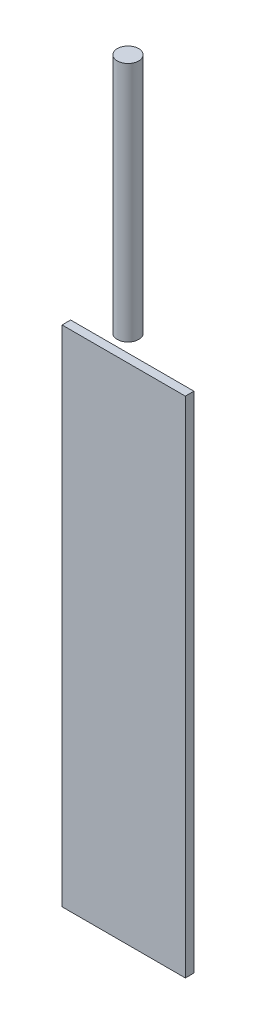
ISO-10303-21;
HEADER;
FILE_DESCRIPTION(('STEP AP214'),'2;1');
FILE_NAME('part.step','',(''),(''),'','','');
FILE_SCHEMA(('AUTOMOTIVE_DESIGN { 1 0 10303 214 1 1 1 1 }'));
ENDSEC;
DATA;
#1=APPLICATION_CONTEXT('core data for automotive mechanical design processes');
#2=APPLICATION_PROTOCOL_DEFINITION('international standard','automotive_design',2000,#1);
#3=PRODUCT_CONTEXT('',#1,'mechanical');
#4=PRODUCT('Part','Part','',(#3));
#5=PRODUCT_RELATED_PRODUCT_CATEGORY('part','',(#4));
#6=PRODUCT_DEFINITION_FORMATION('','',#4);
#7=PRODUCT_DEFINITION_CONTEXT('part definition',#1,'design');
#8=PRODUCT_DEFINITION('design','',#6,#7);
#9=PRODUCT_DEFINITION_SHAPE('','',#8);
#10=(LENGTH_UNIT() NAMED_UNIT(*) SI_UNIT(.MILLI.,.METRE.));
#11=(NAMED_UNIT(*) PLANE_ANGLE_UNIT() SI_UNIT($,.RADIAN.));
#12=(NAMED_UNIT(*) SI_UNIT($,.STERADIAN.) SOLID_ANGLE_UNIT());
#13=UNCERTAINTY_MEASURE_WITH_UNIT(LENGTH_MEASURE(1.E-05),#10,'distance_accuracy_value','');
#14=(GEOMETRIC_REPRESENTATION_CONTEXT(3) GLOBAL_UNCERTAINTY_ASSIGNED_CONTEXT((#13)) GLOBAL_UNIT_ASSIGNED_CONTEXT((#10,
#11,#12)) REPRESENTATION_CONTEXT('',''));
#15=CARTESIAN_POINT('',(0.,0.,0.));
#16=DIRECTION('',(0.,0.,1.));
#17=DIRECTION('',(1.,0.,0.));
#18=AXIS2_PLACEMENT_3D('',#15,#16,#17);
#19=CARTESIAN_POINT('',(20.,-132.5,26.));
#20=DIRECTION('',(0.,-1.,0.));
#21=DIRECTION('',(0.,0.,-1.));
#22=AXIS2_PLACEMENT_3D('',#19,#20,#21);
#23=CYLINDRICAL_SURFACE('',#22,2.);
#24=CARTESIAN_POINT('',(20.,-132.5,26.));
#25=DIRECTION('',(0.,1.,0.));
#26=DIRECTION('',(0.,0.,1.));
#27=AXIS2_PLACEMENT_3D('',#24,#25,#26);
#28=CIRCLE('',#27,2.);
#29=CARTESIAN_POINT('',(20.,-132.5,24.));
#30=VERTEX_POINT('',#29);
#31=EDGE_CURVE('E11',#30,#30,#28,.T.);
#32=CARTESIAN_POINT('',(20.,-177.5,26.));
#33=DIRECTION('',(0.,1.,0.));
#34=DIRECTION('',(0.,0.,1.));
#35=AXIS2_PLACEMENT_3D('',#32,#33,#34);
#36=CIRCLE('',#35,2.);
#37=CARTESIAN_POINT('',(20.,-177.5,24.));
#38=VERTEX_POINT('',#37);
#39=EDGE_CURVE('E50',#38,#38,#36,.T.);
#40=CARTESIAN_POINT('',(20.,-132.5,24.));
#41=CARTESIAN_POINT('',(20.,-132.96875,24.));
#42=CARTESIAN_POINT('',(20.,-133.4375,24.));
#43=CARTESIAN_POINT('',(20.,-134.375,24.));
#44=CARTESIAN_POINT('',(20.,-134.84375,24.));
#45=CARTESIAN_POINT('',(20.,-135.78125,24.));
#46=CARTESIAN_POINT('',(20.,-136.25,24.));
#47=CARTESIAN_POINT('',(20.,-137.1875,24.));
#48=CARTESIAN_POINT('',(20.,-137.65625,24.));
#49=CARTESIAN_POINT('',(20.,-138.59375,24.));
#50=CARTESIAN_POINT('',(20.,-139.0625,24.));
#51=CARTESIAN_POINT('',(20.,-140.,24.));
#52=CARTESIAN_POINT('',(20.,-140.46875,24.));
#53=CARTESIAN_POINT('',(20.,-141.40625,24.));
#54=CARTESIAN_POINT('',(20.,-141.875,24.));
#55=CARTESIAN_POINT('',(20.,-142.8125,24.));
#56=CARTESIAN_POINT('',(20.,-143.28125,24.));
#57=CARTESIAN_POINT('',(20.,-144.21875,24.));
#58=CARTESIAN_POINT('',(20.,-144.6875,24.));
#59=CARTESIAN_POINT('',(20.,-145.625,24.));
#60=CARTESIAN_POINT('',(20.,-146.09375,24.));
#61=CARTESIAN_POINT('',(20.,-147.03125,24.));
#62=CARTESIAN_POINT('',(20.,-147.5,24.));
#63=CARTESIAN_POINT('',(20.,-148.4375,24.));
#64=CARTESIAN_POINT('',(20.,-148.90625,24.));
#65=CARTESIAN_POINT('',(20.,-149.84375,24.));
#66=CARTESIAN_POINT('',(20.,-150.3125,24.));
#67=CARTESIAN_POINT('',(20.,-151.25,24.));
#68=CARTESIAN_POINT('',(20.,-151.71875,24.));
#69=CARTESIAN_POINT('',(20.,-152.65625,24.));
#70=CARTESIAN_POINT('',(20.,-153.125,24.));
#71=CARTESIAN_POINT('',(20.,-154.0625,24.));
#72=CARTESIAN_POINT('',(20.,-154.53125,24.));
#73=CARTESIAN_POINT('',(20.,-155.46875,24.));
#74=CARTESIAN_POINT('',(20.,-155.9375,24.));
#75=CARTESIAN_POINT('',(20.,-156.875,24.));
#76=CARTESIAN_POINT('',(20.,-157.34375,24.));
#77=CARTESIAN_POINT('',(20.,-158.28125,24.));
#78=CARTESIAN_POINT('',(20.,-158.75,24.));
#79=CARTESIAN_POINT('',(20.,-159.6875,24.));
#80=CARTESIAN_POINT('',(20.,-160.15625,24.));
#81=CARTESIAN_POINT('',(20.,-161.09375,24.));
#82=CARTESIAN_POINT('',(20.,-161.5625,24.));
#83=CARTESIAN_POINT('',(20.,-162.5,24.));
#84=CARTESIAN_POINT('',(20.,-162.96875,24.));
#85=CARTESIAN_POINT('',(20.,-163.90625,24.));
#86=CARTESIAN_POINT('',(20.,-164.375,24.));
#87=CARTESIAN_POINT('',(20.,-165.3125,24.));
#88=CARTESIAN_POINT('',(20.,-165.78125,24.));
#89=CARTESIAN_POINT('',(20.,-166.71875,24.));
#90=CARTESIAN_POINT('',(20.,-167.1875,24.));
#91=CARTESIAN_POINT('',(20.,-168.125,24.));
#92=CARTESIAN_POINT('',(20.,-168.59375,24.));
#93=CARTESIAN_POINT('',(20.,-169.53125,24.));
#94=CARTESIAN_POINT('',(20.,-170.,24.));
#95=CARTESIAN_POINT('',(20.,-170.9375,24.));
#96=CARTESIAN_POINT('',(20.,-171.40625,24.));
#97=CARTESIAN_POINT('',(20.,-172.34375,24.));
#98=CARTESIAN_POINT('',(20.,-172.8125,24.));
#99=CARTESIAN_POINT('',(20.,-173.75,24.));
#100=CARTESIAN_POINT('',(20.,-174.21875,24.));
#101=CARTESIAN_POINT('',(20.,-175.15625,24.));
#102=CARTESIAN_POINT('',(20.,-175.625,24.));
#103=CARTESIAN_POINT('',(20.,-176.5625,24.));
#104=CARTESIAN_POINT('',(20.,-177.03125,24.));
#105=CARTESIAN_POINT('',(20.,-177.5,24.));
#106=B_SPLINE_CURVE_WITH_KNOTS('',3,(#40,#41,#42,#43,#44,#45,#46,#47,#48,#49,#50,#51,#52,#53,
#54,#55,#56,#57,#58,#59,#60,#61,#62,#63,#64,#65,#66,#67,#68,#69,#70,#71,#72,#73,#74,#75,#76,#77,
#78,#79,#80,#81,#82,#83,#84,#85,#86,#87,#88,#89,#90,#91,#92,#93,#94,#95,#96,#97,#98,#99,#100,
#101,#102,#103,#104,#105),.UNSPECIFIED.,.F.,.F.,(4,2,2,2,2,2,2,2,2,2,2,2,2,2,2,2,2,2,2,2,2,2,2,
2,2,2,2,2,2,2,2,2,4),(0.,1.40625000000003,2.81250000000002,4.21875000000002,5.62500000000002,
7.03125000000002,8.43750000000001,9.84375000000001,11.25,12.65625,14.0625,15.46875,16.875,
18.28125,19.6875,21.09375,22.5,23.90625,25.3125,26.71875,28.125,29.53125,30.9375,32.34375,33.75,
35.15625,36.5625,37.96875,39.375,40.78125,42.1875,43.59375,45.),.UNSPECIFIED.);
#107=EDGE_CURVE('BSEAM47',#30,#38,#106,.T.);
#108=ORIENTED_EDGE('',*,*,#31,.F.);
#109=ORIENTED_EDGE('',*,*,#39,.T.);
#110=ORIENTED_EDGE('',*,*,#107,.T.);
#111=ORIENTED_EDGE('',*,*,#107,.F.);
#112=EDGE_LOOP('',(#108,#110,#109,#111));
#113=FACE_BOUND('',#112,.T.);
#114=ADVANCED_FACE('F47',(#113),#23,.T.);
#115=CARTESIAN_POINT('',(20.,-132.5,26.));
#116=DIRECTION('',(0.,1.,0.));
#117=DIRECTION('',(0.,0.,1.));
#118=AXIS2_PLACEMENT_3D('',#115,#116,#117);
#119=PLANE('',#118);
#120=ORIENTED_EDGE('',*,*,#31,.T.);
#121=EDGE_LOOP('',(#120));
#122=FACE_BOUND('',#121,.T.);
#123=ADVANCED_FACE('F62',(#122),#119,.T.);
#124=CARTESIAN_POINT('',(20.,-177.5,26.));
#125=DIRECTION('',(0.,1.,0.));
#126=DIRECTION('',(0.,0.,1.));
#127=AXIS2_PLACEMENT_3D('',#124,#125,#126);
#128=PLANE('',#127);
#129=ORIENTED_EDGE('',*,*,#39,.F.);
#130=EDGE_LOOP('',(#129));
#131=FACE_BOUND('',#130,.T.);
#132=ADVANCED_FACE('F60',(#131),#128,.F.);
#133=CLOSED_SHELL('',(#114,#123,#132));
#134=MANIFOLD_SOLID_BREP('B2',#133);
#135=CARTESIAN_POINT('',(31.5,-275.5,26.8));
#136=DIRECTION('',(-1.,0.,0.));
#137=DIRECTION('',(0.,0.,1.));
#138=AXIS2_PLACEMENT_3D('',#135,#136,#137);
#139=PLANE('',#138);
#140=DIRECTION('',(0.,1.,0.));
#141=VECTOR('',#140,1.);
#142=CARTESIAN_POINT('',(31.5,-275.5,25.2));
#143=LINE('',#142,#141);
#144=CARTESIAN_POINT('',(31.5,-275.5,25.2));
#145=VERTEX_POINT('',#144);
#146=CARTESIAN_POINT('',(31.5,-181.5,25.2));
#147=VERTEX_POINT('',#146);
#148=EDGE_CURVE('E163',#145,#147,#143,.T.);
#149=ORIENTED_EDGE('',*,*,#148,.T.);
#150=DIRECTION('',(0.,0.,-1.));
#151=VECTOR('',#150,1.);
#152=CARTESIAN_POINT('',(31.5,-181.5,26.8));
#153=LINE('',#152,#151);
#154=CARTESIAN_POINT('',(31.5,-181.5,26.8));
#155=VERTEX_POINT('',#154);
#156=EDGE_CURVE('E45',#155,#147,#153,.T.);
#157=ORIENTED_EDGE('',*,*,#156,.F.);
#158=DIRECTION('',(0.,1.,0.));
#159=VECTOR('',#158,1.);
#160=CARTESIAN_POINT('',(31.5,-275.5,26.8));
#161=LINE('',#160,#159);
#162=CARTESIAN_POINT('',(31.5,-275.5,26.8));
#163=VERTEX_POINT('',#162);
#164=EDGE_CURVE('E151',#163,#155,#161,.T.);
#165=ORIENTED_EDGE('',*,*,#164,.F.);
#166=DIRECTION('',(0.,0.,-1.));
#167=VECTOR('',#166,1.);
#168=CARTESIAN_POINT('',(31.5,-275.5,26.8));
#169=LINE('',#168,#167);
#170=EDGE_CURVE('E159',#163,#145,#169,.T.);
#171=ORIENTED_EDGE('',*,*,#170,.T.);
#172=EDGE_LOOP('',(#149,#157,#165,#171));
#173=FACE_BOUND('',#172,.T.);
#174=ADVANCED_FACE('F100',(#173),#139,.F.);
#175=CARTESIAN_POINT('',(8.5,-181.5,26.8));
#176=DIRECTION('',(0.,-1.,0.));
#177=DIRECTION('',(0.,0.,-1.));
#178=AXIS2_PLACEMENT_3D('',#175,#176,#177);
#179=PLANE('',#178);
#180=DIRECTION('',(-1.,0.,0.));
#181=VECTOR('',#180,1.);
#182=CARTESIAN_POINT('',(8.5,-181.5,25.2));
#183=LINE('',#182,#181);
#184=CARTESIAN_POINT('',(8.5,-181.5,25.2));
#185=VERTEX_POINT('',#184);
#186=EDGE_CURVE('E155',#147,#185,#183,.T.);
#187=ORIENTED_EDGE('',*,*,#186,.T.);
#188=DIRECTION('',(0.,0.,-1.));
#189=VECTOR('',#188,1.);
#190=CARTESIAN_POINT('',(8.5,-181.5,26.8));
#191=LINE('',#190,#189);
#192=CARTESIAN_POINT('',(8.5,-181.5,26.8));
#193=VERTEX_POINT('',#192);
#194=EDGE_CURVE('E108',#193,#185,#191,.T.);
#195=ORIENTED_EDGE('',*,*,#194,.F.);
#196=DIRECTION('',(-1.,0.,0.));
#197=VECTOR('',#196,1.);
#198=CARTESIAN_POINT('',(8.5,-181.5,26.8));
#199=LINE('',#198,#197);
#200=EDGE_CURVE('E146',#155,#193,#199,.T.);
#201=ORIENTED_EDGE('',*,*,#200,.F.);
#202=ORIENTED_EDGE('',*,*,#156,.T.);
#203=EDGE_LOOP('',(#187,#195,#201,#202));
#204=FACE_BOUND('',#203,.T.);
#205=ADVANCED_FACE('F154',(#204),#179,.F.);
#206=CARTESIAN_POINT('',(8.5,-275.5,26.8));
#207=DIRECTION('',(1.,0.,0.));
#208=DIRECTION('',(0.,0.,-1.));
#209=AXIS2_PLACEMENT_3D('',#206,#207,#208);
#210=PLANE('',#209);
#211=DIRECTION('',(0.,-1.,0.));
#212=VECTOR('',#211,1.);
#213=CARTESIAN_POINT('',(8.5,-275.5,25.2));
#214=LINE('',#213,#212);
#215=CARTESIAN_POINT('',(8.5,-275.5,25.2));
#216=VERTEX_POINT('',#215);
#217=EDGE_CURVE('E133',#185,#216,#214,.T.);
#218=ORIENTED_EDGE('',*,*,#217,.T.);
#219=DIRECTION('',(0.,0.,-1.));
#220=VECTOR('',#219,1.);
#221=CARTESIAN_POINT('',(8.5,-275.5,26.8));
#222=LINE('',#221,#220);
#223=CARTESIAN_POINT('',(8.5,-275.5,26.8));
#224=VERTEX_POINT('',#223);
#225=EDGE_CURVE('E156',#224,#216,#222,.T.);
#226=ORIENTED_EDGE('',*,*,#225,.F.);
#227=DIRECTION('',(0.,-1.,0.));
#228=VECTOR('',#227,1.);
#229=CARTESIAN_POINT('',(8.5,-275.5,26.8));
#230=LINE('',#229,#228);
#231=EDGE_CURVE('E149',#193,#224,#230,.T.);
#232=ORIENTED_EDGE('',*,*,#231,.F.);
#233=ORIENTED_EDGE('',*,*,#194,.T.);
#234=EDGE_LOOP('',(#218,#226,#232,#233));
#235=FACE_BOUND('',#234,.T.);
#236=ADVANCED_FACE('F157',(#235),#210,.F.);
#237=CARTESIAN_POINT('',(8.5,-275.5,26.8));
#238=DIRECTION('',(0.,1.,0.));
#239=DIRECTION('',(0.,0.,1.));
#240=AXIS2_PLACEMENT_3D('',#237,#238,#239);
#241=PLANE('',#240);
#242=DIRECTION('',(1.,0.,0.));
#243=VECTOR('',#242,1.);
#244=CARTESIAN_POINT('',(8.5,-275.5,25.2));
#245=LINE('',#244,#243);
#246=EDGE_CURVE('E139',#216,#145,#245,.T.);
#247=ORIENTED_EDGE('',*,*,#246,.T.);
#248=ORIENTED_EDGE('',*,*,#170,.F.);
#249=DIRECTION('',(1.,0.,0.));
#250=VECTOR('',#249,1.);
#251=CARTESIAN_POINT('',(8.5,-275.5,26.8));
#252=LINE('',#251,#250);
#253=EDGE_CURVE('E116',#224,#163,#252,.T.);
#254=ORIENTED_EDGE('',*,*,#253,.F.);
#255=ORIENTED_EDGE('',*,*,#225,.T.);
#256=EDGE_LOOP('',(#247,#248,#254,#255));
#257=FACE_BOUND('',#256,.T.);
#258=ADVANCED_FACE('F170',(#257),#241,.F.);
#259=CARTESIAN_POINT('',(0.,0.,26.8));
#260=DIRECTION('',(0.,0.,-1.));
#261=DIRECTION('',(-1.,0.,0.));
#262=AXIS2_PLACEMENT_3D('',#259,#260,#261);
#263=PLANE('',#262);
#264=ORIENTED_EDGE('',*,*,#164,.T.);
#265=ORIENTED_EDGE('',*,*,#200,.T.);
#266=ORIENTED_EDGE('',*,*,#231,.T.);
#267=ORIENTED_EDGE('',*,*,#253,.T.);
#268=EDGE_LOOP('',(#264,#265,#266,#267));
#269=FACE_BOUND('',#268,.T.);
#270=ADVANCED_FACE('F147',(#269),#263,.F.);
#271=CARTESIAN_POINT('',(0.,0.,25.2));
#272=DIRECTION('',(0.,0.,-1.));
#273=DIRECTION('',(-1.,0.,0.));
#274=AXIS2_PLACEMENT_3D('',#271,#272,#273);
#275=PLANE('',#274);
#276=ORIENTED_EDGE('',*,*,#148,.F.);
#277=ORIENTED_EDGE('',*,*,#246,.F.);
#278=ORIENTED_EDGE('',*,*,#217,.F.);
#279=ORIENTED_EDGE('',*,*,#186,.F.);
#280=EDGE_LOOP('',(#276,#277,#278,#279));
#281=FACE_BOUND('',#280,.T.);
#282=ADVANCED_FACE('F173',(#281),#275,.T.);
#283=CLOSED_SHELL('',(#174,#205,#236,#258,#270,#282));
#284=MANIFOLD_SOLID_BREP('B6',#283);
#285=ADVANCED_BREP_SHAPE_REPRESENTATION('',(#18,#134,#284),#14);
#286=SHAPE_DEFINITION_REPRESENTATION(#9,#285);
ENDSEC;
END-ISO-10303-21;
